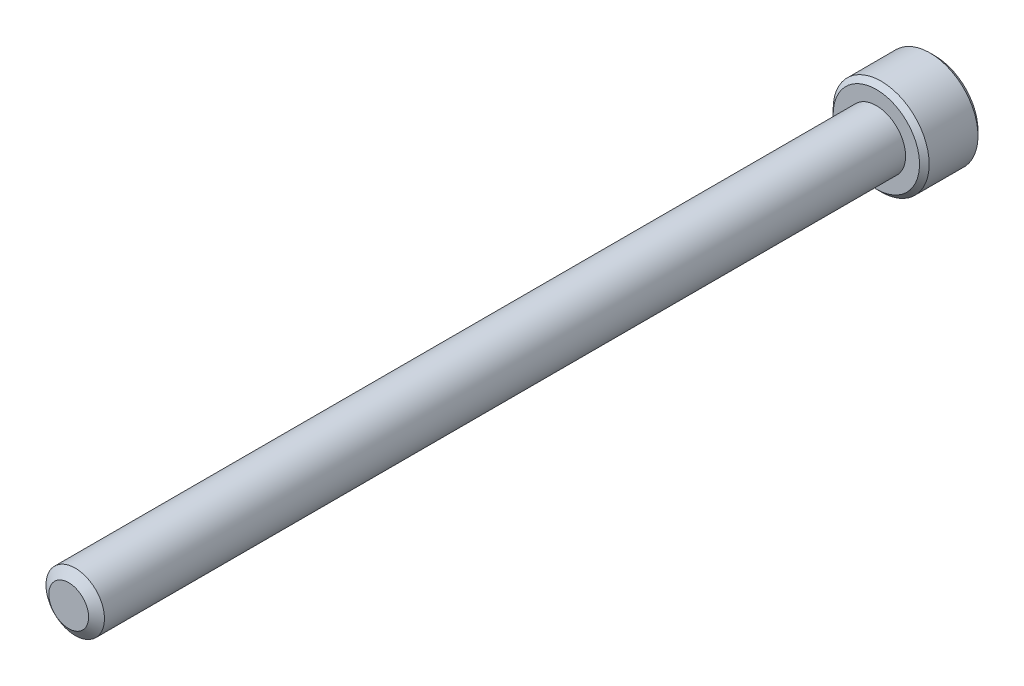
ISO-10303-21;
HEADER;
FILE_DESCRIPTION(('STEP AP214'),'2;1');
FILE_NAME('part.step','',(''),(''),'','','');
FILE_SCHEMA(('AUTOMOTIVE_DESIGN { 1 0 10303 214 1 1 1 1 }'));
ENDSEC;
DATA;
#1=APPLICATION_CONTEXT('core data for automotive mechanical design processes');
#2=APPLICATION_PROTOCOL_DEFINITION('international standard','automotive_design',2000,#1);
#3=PRODUCT_CONTEXT('',#1,'mechanical');
#4=PRODUCT('Part','Part','',(#3));
#5=PRODUCT_RELATED_PRODUCT_CATEGORY('part','',(#4));
#6=PRODUCT_DEFINITION_FORMATION('','',#4);
#7=PRODUCT_DEFINITION_CONTEXT('part definition',#1,'design');
#8=PRODUCT_DEFINITION('design','',#6,#7);
#9=PRODUCT_DEFINITION_SHAPE('','',#8);
#10=(LENGTH_UNIT() NAMED_UNIT(*) SI_UNIT(.MILLI.,.METRE.));
#11=(NAMED_UNIT(*) PLANE_ANGLE_UNIT() SI_UNIT($,.RADIAN.));
#12=(NAMED_UNIT(*) SI_UNIT($,.STERADIAN.) SOLID_ANGLE_UNIT());
#13=UNCERTAINTY_MEASURE_WITH_UNIT(LENGTH_MEASURE(1.E-05),#10,'distance_accuracy_value','');
#14=(GEOMETRIC_REPRESENTATION_CONTEXT(3) GLOBAL_UNCERTAINTY_ASSIGNED_CONTEXT((#13)) GLOBAL_UNIT_ASSIGNED_CONTEXT((#10,
#11,#12)) REPRESENTATION_CONTEXT('',''));
#15=CARTESIAN_POINT('',(0.,0.,0.));
#16=DIRECTION('',(0.,0.,1.));
#17=DIRECTION('',(1.,0.,0.));
#18=AXIS2_PLACEMENT_3D('',#15,#16,#17);
#19=CARTESIAN_POINT('',(0.,0.,-4.826));
#20=DIRECTION('',(0.,0.,1.));
#21=DIRECTION('',(1.,0.,0.));
#22=AXIS2_PLACEMENT_3D('',#19,#20,#21);
#23=PLANE('',#22);
#24=CARTESIAN_POINT('',(0.,0.,-4.826));
#25=DIRECTION('',(0.,0.,1.));
#26=DIRECTION('',(1.,0.,0.));
#27=AXIS2_PLACEMENT_3D('',#24,#25,#26);
#28=CIRCLE('',#27,3.56616000000001);
#29=CARTESIAN_POINT('',(3.56616000000001,0.,-4.826));
#30=VERTEX_POINT('',#29);
#31=EDGE_CURVE('E11',#30,#30,#28,.F.);
#32=ORIENTED_EDGE('',*,*,#31,.T.);
#33=EDGE_LOOP('',(#32));
#34=FACE_BOUND('',#33,.T.);
#35=CARTESIAN_POINT('',(0.,0.,-4.826));
#36=DIRECTION('',(0.,0.,-1.));
#37=DIRECTION('',(-1.,0.,0.));
#38=AXIS2_PLACEMENT_3D('',#35,#36,#37);
#39=CIRCLE('',#38,2.29135888084633);
#40=CARTESIAN_POINT('',(1.984375,1.14567944042316,-4.826));
#41=VERTEX_POINT('',#40);
#42=CARTESIAN_POINT('',(1.984375,-1.14567944042317,-4.826));
#43=VERTEX_POINT('',#42);
#44=EDGE_CURVE('E57',#41,#43,#39,.T.);
#45=ORIENTED_EDGE('',*,*,#44,.F.);
#46=CARTESIAN_POINT('',(0.,2.29135888084633,-4.826));
#47=VERTEX_POINT('',#46);
#48=EDGE_CURVE('E133',#47,#41,#39,.T.);
#49=ORIENTED_EDGE('',*,*,#48,.F.);
#50=CARTESIAN_POINT('',(-1.984375,1.14567944042317,-4.826));
#51=VERTEX_POINT('',#50);
#52=EDGE_CURVE('E130',#51,#47,#39,.T.);
#53=ORIENTED_EDGE('',*,*,#52,.F.);
#54=CARTESIAN_POINT('',(-1.984375,-1.14567944042317,-4.826));
#55=VERTEX_POINT('',#54);
#56=EDGE_CURVE('E97',#55,#51,#39,.T.);
#57=ORIENTED_EDGE('',*,*,#56,.F.);
#58=CARTESIAN_POINT('',(0.,-2.29135888084633,-4.826));
#59=VERTEX_POINT('',#58);
#60=EDGE_CURVE('E89',#59,#55,#39,.T.);
#61=ORIENTED_EDGE('',*,*,#60,.F.);
#62=EDGE_CURVE('E50',#43,#59,#39,.T.);
#63=ORIENTED_EDGE('',*,*,#62,.F.);
#64=EDGE_LOOP('',(#45,#49,#53,#57,#61,#63));
#65=FACE_BOUND('',#64,.T.);
#66=ADVANCED_FACE('F36',(#34,#65),#23,.F.);
#67=CARTESIAN_POINT('',(0.,0.,66.675));
#68=DIRECTION('',(0.,0.,-1.));
#69=DIRECTION('',(-1.,0.,0.));
#70=AXIS2_PLACEMENT_3D('',#67,#68,#69);
#71=CYLINDRICAL_SURFACE('',#70,2.413);
#72=CARTESIAN_POINT('',(0.,0.,66.1361512711798));
#73=DIRECTION('',(0.,0.,-1.));
#74=DIRECTION('',(-1.,0.,0.));
#75=AXIS2_PLACEMENT_3D('',#72,#73,#74);
#76=CIRCLE('',#75,2.413);
#77=CARTESIAN_POINT('',(-2.413,0.,66.1361512711798));
#78=VERTEX_POINT('',#77);
#79=EDGE_CURVE('E165',#78,#78,#76,.T.);
#80=ORIENTED_EDGE('',*,*,#79,.T.);
#81=EDGE_LOOP('',(#80));
#82=FACE_BOUND('',#81,.T.);
#83=CARTESIAN_POINT('',(0.,0.,0.));
#84=DIRECTION('',(0.,0.,1.));
#85=DIRECTION('',(1.,0.,0.));
#86=AXIS2_PLACEMENT_3D('',#83,#84,#85);
#87=CIRCLE('',#86,2.413);
#88=CARTESIAN_POINT('',(2.413,0.,0.));
#89=VERTEX_POINT('',#88);
#90=EDGE_CURVE('E164',#89,#89,#87,.T.);
#91=ORIENTED_EDGE('',*,*,#90,.T.);
#92=EDGE_LOOP('',(#91));
#93=FACE_BOUND('',#92,.T.);
#94=ADVANCED_FACE('F231',(#82,#93),#71,.T.);
#95=CARTESIAN_POINT('',(0.,0.,66.675));
#96=DIRECTION('',(0.,0.,-1.));
#97=DIRECTION('',(-1.,0.,0.));
#98=AXIS2_PLACEMENT_3D('',#95,#96,#97);
#99=CONICAL_SURFACE('',#98,1.643444262,0.95993108859688);
#100=ORIENTED_EDGE('',*,*,#79,.F.);
#101=EDGE_LOOP('',(#100));
#102=FACE_BOUND('',#101,.T.);
#103=CARTESIAN_POINT('',(0.,0.,66.675));
#104=DIRECTION('',(0.,0.,-1.));
#105=DIRECTION('',(-1.,0.,0.));
#106=AXIS2_PLACEMENT_3D('',#103,#104,#105);
#107=CIRCLE('',#106,1.643444262);
#108=CARTESIAN_POINT('',(-1.643444262,0.,66.675));
#109=VERTEX_POINT('',#108);
#110=EDGE_CURVE('E109',#109,#109,#107,.T.);
#111=ORIENTED_EDGE('',*,*,#110,.T.);
#112=EDGE_LOOP('',(#111));
#113=FACE_BOUND('',#112,.T.);
#114=ADVANCED_FACE('F241',(#102,#113),#99,.T.);
#115=CARTESIAN_POINT('',(0.,0.,66.675));
#116=DIRECTION('',(0.,0.,1.));
#117=DIRECTION('',(1.,0.,0.));
#118=AXIS2_PLACEMENT_3D('',#115,#116,#117);
#119=PLANE('',#118);
#120=ORIENTED_EDGE('',*,*,#110,.F.);
#121=EDGE_LOOP('',(#120));
#122=FACE_BOUND('',#121,.T.);
#123=ADVANCED_FACE('F239',(#122),#119,.T.);
#124=CARTESIAN_POINT('',(0.,0.,-4.826));
#125=DIRECTION('',(0.,0.,1.));
#126=DIRECTION('',(1.,0.,0.));
#127=AXIS2_PLACEMENT_3D('',#124,#125,#126);
#128=CYLINDRICAL_SURFACE('',#127,3.9624);
#129=CARTESIAN_POINT('',(0.,0.,-0.396240000000008));
#130=DIRECTION('',(0.,0.,1.));
#131=DIRECTION('',(1.,0.,0.));
#132=AXIS2_PLACEMENT_3D('',#129,#130,#131);
#133=CIRCLE('',#132,3.9624);
#134=CARTESIAN_POINT('',(-3.9624,0.,-0.396240000000008));
#135=VERTEX_POINT('',#134);
#136=EDGE_CURVE('E44',#135,#135,#133,.F.);
#137=ORIENTED_EDGE('',*,*,#136,.T.);
#138=EDGE_LOOP('',(#137));
#139=FACE_BOUND('',#138,.T.);
#140=CARTESIAN_POINT('',(0.,0.,-4.42976000000001));
#141=DIRECTION('',(0.,0.,1.));
#142=DIRECTION('',(1.,0.,0.));
#143=AXIS2_PLACEMENT_3D('',#140,#141,#142);
#144=CIRCLE('',#143,3.9624);
#145=CARTESIAN_POINT('',(3.9624,0.,-4.42976000000001));
#146=VERTEX_POINT('',#145);
#147=EDGE_CURVE('E261',#146,#146,#144,.T.);
#148=ORIENTED_EDGE('',*,*,#147,.T.);
#149=EDGE_LOOP('',(#148));
#150=FACE_BOUND('',#149,.T.);
#151=ADVANCED_FACE('F235',(#139,#150),#128,.T.);
#152=CARTESIAN_POINT('',(0.,0.,0.));
#153=DIRECTION('',(0.,0.,1.));
#154=DIRECTION('',(1.,0.,0.));
#155=AXIS2_PLACEMENT_3D('',#152,#153,#154);
#156=PLANE('',#155);
#157=CARTESIAN_POINT('',(0.,0.,0.));
#158=DIRECTION('',(0.,0.,1.));
#159=DIRECTION('',(1.,0.,0.));
#160=AXIS2_PLACEMENT_3D('',#157,#158,#159);
#161=CIRCLE('',#160,3.56616);
#162=CARTESIAN_POINT('',(-3.56616,0.,0.));
#163=VERTEX_POINT('',#162);
#164=EDGE_CURVE('E108',#163,#163,#161,.T.);
#165=ORIENTED_EDGE('',*,*,#164,.T.);
#166=EDGE_LOOP('',(#165));
#167=FACE_BOUND('',#166,.T.);
#168=ORIENTED_EDGE('',*,*,#90,.F.);
#169=EDGE_LOOP('',(#168));
#170=FACE_BOUND('',#169,.T.);
#171=ADVANCED_FACE('F185',(#167,#170),#156,.T.);
#172=CARTESIAN_POINT('',(0.,0.,-4.826));
#173=DIRECTION('',(0.,0.,-1.));
#174=DIRECTION('',(-1.,0.,0.));
#175=AXIS2_PLACEMENT_3D('',#172,#173,#174);
#176=CONICAL_SURFACE('',#175,2.29135888084633,0.78539816339745);
#177=CARTESIAN_POINT('',(-1.984375,4.38635024598007,-7.34897519782274));
#178=CARTESIAN_POINT('',(-1.984375,4.25778236916222,-7.23187255043514));
#179=CARTESIAN_POINT('',(-1.984375,4.12880938963501,-7.1152075711675));
#180=CARTESIAN_POINT('',(-1.984375,3.8697150482739,-6.88309307113962));
#181=CARTESIAN_POINT('',(-1.984375,3.73959339744263,-6.76764387326629));
#182=CARTESIAN_POINT('',(-1.984375,3.47693738702936,-6.53749248847528));
#183=CARTESIAN_POINT('',(-1.984375,3.3443922128216,-6.42280261206569));
#184=CARTESIAN_POINT('',(-1.984375,3.07740414215957,-6.19568123842686));
#185=CARTESIAN_POINT('',(-1.984375,2.94296150861167,-6.08324943345639));
#186=CARTESIAN_POINT('',(-1.984375,2.69093433000247,-5.87745000368473));
#187=CARTESIAN_POINT('',(-1.984375,2.57369587574335,-5.78365991859573));
#188=CARTESIAN_POINT('',(-1.984375,2.33669402095219,-5.59933006518558));
#189=CARTESIAN_POINT('',(-1.984375,2.21693090511933,-5.5087899334554));
#190=CARTESIAN_POINT('',(-1.984375,1.97414978626332,-5.33250529335592));
#191=CARTESIAN_POINT('',(-1.984375,1.8511363783479,-5.24675449786087));
#192=CARTESIAN_POINT('',(-1.984375,1.60051911268812,-5.08227129509849));
#193=CARTESIAN_POINT('',(-1.984375,1.47291846186661,-5.00353411359307));
#194=CARTESIAN_POINT('',(-1.984375,1.2789090002779,-4.89486132815752));
#195=CARTESIAN_POINT('',(-1.984375,1.21488472401634,-4.86070149112759));
#196=CARTESIAN_POINT('',(-1.984375,1.08519642932975,-4.79566586392286));
#197=CARTESIAN_POINT('',(-1.984375,1.01953210237452,-4.76479069750205));
#198=CARTESIAN_POINT('',(-1.984375,0.81999148678731,-4.67842375900681));
#199=CARTESIAN_POINT('',(-1.984375,0.683245753728957,-4.62900101211804));
#200=CARTESIAN_POINT('',(-1.984375,0.48625684861587,-4.5769842359019));
#201=CARTESIAN_POINT('',(-1.984375,0.428714400653208,-4.56399752017917));
#202=CARTESIAN_POINT('',(-1.984375,0.312779003368322,-4.5427082809321));
#203=CARTESIAN_POINT('',(-1.984375,0.254386491647091,-4.53440342902996));
#204=CARTESIAN_POINT('',(-1.984375,0.137202439336304,-4.52290067704976));
#205=CARTESIAN_POINT('',(-1.984375,0.0784118196893296,-4.51969349911655));
#206=CARTESIAN_POINT('',(-1.984375,-0.0392233767990006,-4.51853221278239));
#207=CARTESIAN_POINT('',(-1.984375,-0.0980679542441397,-4.52057816389864));
#208=CARTESIAN_POINT('',(-1.984375,-0.21520013647359,-4.52979857799852));
#209=CARTESIAN_POINT('',(-1.984375,-0.273488761914176,-4.53696028481731));
#210=CARTESIAN_POINT('',(-1.984375,-0.389286265316371,-4.55603259141478));
#211=CARTESIAN_POINT('',(-1.984375,-0.446794960098088,-4.567944287499));
#212=CARTESIAN_POINT('',(-1.984375,-0.56091102362673,-4.59602327187489));
#213=CARTESIAN_POINT('',(-1.984375,-0.61751563591901,-4.61220162881068));
#214=CARTESIAN_POINT('',(-1.984375,-0.729535693290378,-4.64820502249007));
#215=CARTESIAN_POINT('',(-1.984375,-0.784951198991555,-4.66802987283546));
#216=CARTESIAN_POINT('',(-1.984375,-0.914325334864688,-4.7184487048077));
#217=CARTESIAN_POINT('',(-1.984375,-0.987772757857292,-4.7503494712672));
#218=CARTESIAN_POINT('',(-1.984375,-1.13259042621503,-4.81859015311983));
#219=CARTESIAN_POINT('',(-1.984375,-1.20395954857947,-4.85493241529602));
#220=CARTESIAN_POINT('',(-1.984375,-1.34496189830389,-4.93112595582489));
#221=CARTESIAN_POINT('',(-1.984375,-1.41459154292871,-4.97098381524999));
#222=CARTESIAN_POINT('',(-1.984375,-1.55223895461487,-5.05340283838906));
#223=CARTESIAN_POINT('',(-1.984375,-1.62025639194186,-5.09596454866417));
#224=CARTESIAN_POINT('',(-1.984375,-1.823662914216,-5.22772004019455));
#225=CARTESIAN_POINT('',(-1.984375,-1.95694317622707,-5.32016210087376));
#226=CARTESIAN_POINT('',(-1.984375,-2.21933064334271,-5.51039077948145));
#227=CARTESIAN_POINT('',(-1.984375,-2.34844239081737,-5.60817124432184));
#228=CARTESIAN_POINT('',(-1.984375,-2.64424712607428,-5.83898376478607));
#229=CARTESIAN_POINT('',(-1.984375,-2.80988215135694,-5.97336658258107));
#230=CARTESIAN_POINT('',(-1.984375,-3.13786393939787,-6.24620657210738));
#231=CARTESIAN_POINT('',(-1.984375,-3.30020907072943,-6.38466568561171));
#232=CARTESIAN_POINT('',(-1.984375,-3.61743160532523,-6.65987341299285));
#233=CARTESIAN_POINT('',(-1.984375,-3.77238267778691,-6.79653731694909));
#234=CARTESIAN_POINT('',(-1.984375,-4.00353093931969,-7.00284090592041));
#235=CARTESIAN_POINT('',(-1.984375,-4.08033809401079,-7.0718000308107));
#236=CARTESIAN_POINT('',(-1.984375,-4.23359721811938,-7.21010924523581));
#237=CARTESIAN_POINT('',(-1.984375,-4.31004919377067,-7.27945932786121));
#238=CARTESIAN_POINT('',(-1.984375,-4.38635024598007,-7.34897519782274));
#239=B_SPLINE_CURVE_WITH_KNOTS('',3,(#177,#178,#179,#180,#181,#182,#183,#184,#185,#186,#187,
#188,#189,#190,#191,#192,#193,#194,#195,#196,#197,#198,#199,#200,#201,#202,#203,#204,#205,#206,
#207,#208,#209,#210,#211,#212,#213,#214,#215,#216,#217,#218,#219,#220,#221,#222,#223,#224,#225,
#226,#227,#228,#229,#230,#231,#232,#233,#234,#235,#236,#237,#238),.UNSPECIFIED.,.F.,.F.,(4,2,2,
2,2,2,2,2,2,2,2,2,2,2,2,2,2,2,2,2,2,2,2,2,2,2,2,2,2,2,4),(0.,0.521719337468404,1.04357390539815,
1.56938723748946,2.09512841606326,2.54550444646996,2.99582995804647,3.44554970250013,
3.89496094065995,4.11257110412757,4.33022251794828,4.76440966817832,4.94122399976167,
5.11795032054924,5.29435462654118,5.47076093117717,5.64672889434269,5.82273749473955,
5.99920726953631,6.17566802621274,6.41569497411234,6.655849299482,6.89646313424995,
7.1371257628443,7.62347501633089,8.10927507181707,8.74903978219147,9.38911434398421,
10.0089169746635,10.3185808917335,10.6282393531493),.UNSPECIFIED.);
#240=EDGE_CURVE('E102',#51,#55,#239,.T.);
#241=ORIENTED_EDGE('',*,*,#240,.T.);
#242=ORIENTED_EDGE('',*,*,#56,.T.);
#243=EDGE_LOOP('',(#241,#242));
#244=FACE_BOUND('',#243,.T.);
#245=ADVANCED_FACE('F103',(#244),#176,.F.);
#246=CARTESIAN_POINT('',(0.000199999999999783,2.29147435090017,-4.82611547878184));
#247=CARTESIAN_POINT('',(-0.0680159951668025,2.25208982772758,-4.78676285226391));
#248=CARTESIAN_POINT('',(-0.137372685106966,2.21204672412052,-4.74972131044618));
#249=CARTESIAN_POINT('',(-0.278798800452188,2.13039431835551,-4.68189885842332));
#250=CARTESIAN_POINT('',(-0.350881678736783,2.08877724917394,-4.65115568909175));
#251=CARTESIAN_POINT('',(-0.496233397266004,2.00485839535392,-4.59849188881121));
#252=CARTESIAN_POINT('',(-0.569465212486939,1.96257798712287,-4.57643887587996));
#253=CARTESIAN_POINT('',(-0.717541182594706,1.87708628592063,-4.54246149294388));
#254=CARTESIAN_POINT('',(-0.792380812753425,1.83387760530244,-4.53051175609173));
#255=CARTESIAN_POINT('',(-0.921360414543816,1.75941119748879,-4.5197300990819));
#256=CARTESIAN_POINT('',(-0.975333715772442,1.72824969749539,-4.51813389905907));
#257=CARTESIAN_POINT('',(-1.0831921185198,1.66597761963484,-4.52082183886529));
#258=CARTESIAN_POINT('',(-1.13707718248552,1.63486706344893,-4.52510804034046));
#259=CARTESIAN_POINT('',(-1.2443385382486,1.57293969082547,-4.53931687301352));
#260=CARTESIAN_POINT('',(-1.29771419276014,1.54212324232506,-4.54924581045227));
#261=CARTESIAN_POINT('',(-1.4035425174089,1.48102323060122,-4.57419508427454));
#262=CARTESIAN_POINT('',(-1.4559952579711,1.45073962671789,-4.58921503038949));
#263=CARTESIAN_POINT('',(-1.59035733896365,1.37316564308797,-4.63380785163567));
#264=CARTESIAN_POINT('',(-1.67143335715833,1.32635638215845,-4.66674299593833));
#265=CARTESIAN_POINT('',(-1.79064830672984,1.25752759893191,-4.7223424412022));
#266=CARTESIAN_POINT('',(-1.829934924386,1.23484545965257,-4.74187759205186));
#267=CARTESIAN_POINT('',(-1.90778036186805,1.18990137536713,-4.7827287381194));
#268=CARTESIAN_POINT('',(-1.9463396111017,1.16763918244233,-4.80404363956835));
#269=CARTESIAN_POINT('',(-1.984575,1.14556397036933,-4.82611547878184));
#270=B_SPLINE_CURVE_WITH_KNOTS('',3,(#246,#247,#248,#249,#250,#251,#252,#253,#254,#255,#256,
#257,#258,#259,#260,#261,#262,#263,#264,#265,#266,#267,#268,#269),.UNSPECIFIED.,.F.,.F.,(4,2,2,
2,2,2,2,2,2,2,2,4),(0.,0.264339630306626,0.530219665093694,0.79187641637146,1.05287424418109,
1.239639843932,1.42647091743852,1.61351120244035,1.8005371524754,2.09764209964316,
2.24579179873714,2.39385111134157),.UNSPECIFIED.);
#271=EDGE_CURVE('E132',#47,#51,#270,.T.);
#272=ORIENTED_EDGE('',*,*,#271,.T.);
#273=ORIENTED_EDGE('',*,*,#52,.T.);
#274=EDGE_LOOP('',(#272,#273));
#275=FACE_BOUND('',#274,.T.);
#276=ADVANCED_FACE('F184',(#275),#176,.F.);
#277=CARTESIAN_POINT('',(1.984575,1.14556397036933,-4.82611547878184));
#278=CARTESIAN_POINT('',(1.9163590048332,1.18494849354192,-4.78676285226391));
#279=CARTESIAN_POINT('',(1.84700231489303,1.22499159714897,-4.74972131044618));
#280=CARTESIAN_POINT('',(1.70557619954781,1.30664400291398,-4.68189885842332));
#281=CARTESIAN_POINT('',(1.63349332126322,1.34826107209555,-4.65115568909175));
#282=CARTESIAN_POINT('',(1.488141602734,1.43217992591557,-4.59849188881121));
#283=CARTESIAN_POINT('',(1.41490978751306,1.47446033414663,-4.57643887587996));
#284=CARTESIAN_POINT('',(1.26683381740529,1.55995203534886,-4.54246149294388));
#285=CARTESIAN_POINT('',(1.19199418724658,1.60316071596705,-4.53051175609173));
#286=CARTESIAN_POINT('',(1.06301458545619,1.6776271237807,-4.5197300990819));
#287=CARTESIAN_POINT('',(1.00904128422756,1.7087886237741,-4.51813389905907));
#288=CARTESIAN_POINT('',(0.901182881480201,1.77106070163465,-4.52082183886529));
#289=CARTESIAN_POINT('',(0.847297817514478,1.80217125782056,-4.52510804034046));
#290=CARTESIAN_POINT('',(0.740036461751397,1.86409863044402,-4.53931687301352));
#291=CARTESIAN_POINT('',(0.686660807239861,1.89491507894443,-4.54924581045227));
#292=CARTESIAN_POINT('',(0.580832482591104,1.95601509066828,-4.57419508427454));
#293=CARTESIAN_POINT('',(0.528379742028899,1.9862986945516,-4.58921503038949));
#294=CARTESIAN_POINT('',(0.394017661036352,2.06387267818152,-4.63380785163567));
#295=CARTESIAN_POINT('',(0.312941642841677,2.11068193911104,-4.66674299593833));
#296=CARTESIAN_POINT('',(0.193726693270161,2.17951072233758,-4.7223424412022));
#297=CARTESIAN_POINT('',(0.154440075614,2.20219286161692,-4.74187759205186));
#298=CARTESIAN_POINT('',(0.0765946381319476,2.24713694590237,-4.7827287381194));
#299=CARTESIAN_POINT('',(0.0380353888983018,2.26939913882716,-4.80404363956835));
#300=CARTESIAN_POINT('',(-0.000199999999999806,2.29147435090017,-4.82611547878184));
#301=B_SPLINE_CURVE_WITH_KNOTS('',3,(#277,#278,#279,#280,#281,#282,#283,#284,#285,#286,#287,
#288,#289,#290,#291,#292,#293,#294,#295,#296,#297,#298,#299,#300),.UNSPECIFIED.,.F.,.F.,(4,2,2,
2,2,2,2,2,2,2,2,4),(0.,0.264339630306626,0.530219665093694,0.791876416371459,1.05287424418109,
1.239639843932,1.42647091743852,1.61351120244035,1.8005371524754,2.09764209964316,
2.24579179873714,2.39385111134157),.UNSPECIFIED.);
#302=EDGE_CURVE('E136',#41,#47,#301,.T.);
#303=ORIENTED_EDGE('',*,*,#302,.T.);
#304=ORIENTED_EDGE('',*,*,#48,.T.);
#305=EDGE_LOOP('',(#303,#304));
#306=FACE_BOUND('',#305,.T.);
#307=ADVANCED_FACE('F139',(#306),#176,.F.);
#308=CARTESIAN_POINT('',(1.984375,-4.38635024598007,-7.34897519782274));
#309=CARTESIAN_POINT('',(1.984375,-4.25778236916222,-7.23187255043513));
#310=CARTESIAN_POINT('',(1.984375,-4.12880938963501,-7.1152075711675));
#311=CARTESIAN_POINT('',(1.984375,-3.86971504827389,-6.88309307113962));
#312=CARTESIAN_POINT('',(1.984375,-3.73959339744262,-6.76764387326629));
#313=CARTESIAN_POINT('',(1.984375,-3.47693738702935,-6.53749248847528));
#314=CARTESIAN_POINT('',(1.984375,-3.3443922128216,-6.42280261206568));
#315=CARTESIAN_POINT('',(1.984375,-3.07740414215957,-6.19568123842686));
#316=CARTESIAN_POINT('',(1.984375,-2.94296150861167,-6.08324943345639));
#317=CARTESIAN_POINT('',(1.984375,-2.69093433000247,-5.87745000368473));
#318=CARTESIAN_POINT('',(1.984375,-2.57369587574335,-5.78365991859572));
#319=CARTESIAN_POINT('',(1.984375,-2.33669402095219,-5.59933006518558));
#320=CARTESIAN_POINT('',(1.984375,-2.21693090511933,-5.5087899334554));
#321=CARTESIAN_POINT('',(1.984375,-1.97414978626332,-5.33250529335592));
#322=CARTESIAN_POINT('',(1.984375,-1.85113637834789,-5.24675449786087));
#323=CARTESIAN_POINT('',(1.984375,-1.60051911268812,-5.08227129509849));
#324=CARTESIAN_POINT('',(1.984375,-1.47291846186661,-5.00353411359307));
#325=CARTESIAN_POINT('',(1.984375,-1.2789090002779,-4.89486132815752));
#326=CARTESIAN_POINT('',(1.984375,-1.21488472401634,-4.86070149112759));
#327=CARTESIAN_POINT('',(1.984375,-1.08519642932975,-4.79566586392286));
#328=CARTESIAN_POINT('',(1.984375,-1.01953210237452,-4.76479069750204));
#329=CARTESIAN_POINT('',(1.984375,-0.819991486787309,-4.67842375900681));
#330=CARTESIAN_POINT('',(1.984375,-0.683245753728956,-4.62900101211804));
#331=CARTESIAN_POINT('',(1.984375,-0.486256848615869,-4.5769842359019));
#332=CARTESIAN_POINT('',(1.984375,-0.428714400653207,-4.56399752017917));
#333=CARTESIAN_POINT('',(1.984375,-0.312779003368321,-4.54270828093209));
#334=CARTESIAN_POINT('',(1.984375,-0.25438649164709,-4.53440342902996));
#335=CARTESIAN_POINT('',(1.984375,-0.137202439336303,-4.52290067704976));
#336=CARTESIAN_POINT('',(1.984375,-0.0784118196893286,-4.51969349911655));
#337=CARTESIAN_POINT('',(1.984375,0.0392233767990016,-4.51853221278239));
#338=CARTESIAN_POINT('',(1.984375,0.0980679542441407,-4.52057816389864));
#339=CARTESIAN_POINT('',(1.984375,0.215200136473591,-4.52979857799852));
#340=CARTESIAN_POINT('',(1.984375,0.273488761914177,-4.53696028481731));
#341=CARTESIAN_POINT('',(1.984375,0.389286265316373,-4.55603259141478));
#342=CARTESIAN_POINT('',(1.984375,0.446794960098089,-4.567944287499));
#343=CARTESIAN_POINT('',(1.984375,0.560911023626731,-4.59602327187489));
#344=CARTESIAN_POINT('',(1.984375,0.617515635919012,-4.61220162881068));
#345=CARTESIAN_POINT('',(1.984375,0.729535693290379,-4.64820502249007));
#346=CARTESIAN_POINT('',(1.984375,0.784951198991556,-4.66802987283546));
#347=CARTESIAN_POINT('',(1.984375,0.914325334864689,-4.7184487048077));
#348=CARTESIAN_POINT('',(1.984375,0.987772757857293,-4.7503494712672));
#349=CARTESIAN_POINT('',(1.984375,1.13259042621504,-4.81859015311983));
#350=CARTESIAN_POINT('',(1.984375,1.20395954857947,-4.85493241529602));
#351=CARTESIAN_POINT('',(1.984375,1.34496189830389,-4.93112595582489));
#352=CARTESIAN_POINT('',(1.984375,1.41459154292871,-4.97098381524999));
#353=CARTESIAN_POINT('',(1.984375,1.55223895461488,-5.05340283838906));
#354=CARTESIAN_POINT('',(1.984375,1.62025639194186,-5.09596454866417));
#355=CARTESIAN_POINT('',(1.984375,1.823662914216,-5.22772004019455));
#356=CARTESIAN_POINT('',(1.984375,1.95694317622707,-5.32016210087376));
#357=CARTESIAN_POINT('',(1.984375,2.21933064334271,-5.51039077948145));
#358=CARTESIAN_POINT('',(1.984375,2.34844239081737,-5.60817124432184));
#359=CARTESIAN_POINT('',(1.984375,2.64424712607429,-5.83898376478608));
#360=CARTESIAN_POINT('',(1.984375,2.80988215135694,-5.97336658258107));
#361=CARTESIAN_POINT('',(1.984375,3.13786393939788,-6.24620657210738));
#362=CARTESIAN_POINT('',(1.984375,3.30020907072944,-6.38466568561171));
#363=CARTESIAN_POINT('',(1.984375,3.61743160532523,-6.65987341299285));
#364=CARTESIAN_POINT('',(1.984375,3.77238267778691,-6.79653731694909));
#365=CARTESIAN_POINT('',(1.984375,4.00353093931969,-7.00284090592041));
#366=CARTESIAN_POINT('',(1.984375,4.08033809401079,-7.0718000308107));
#367=CARTESIAN_POINT('',(1.984375,4.23359721811938,-7.21010924523581));
#368=CARTESIAN_POINT('',(1.984375,4.31004919377067,-7.27945932786121));
#369=CARTESIAN_POINT('',(1.984375,4.38635024598007,-7.34897519782274));
#370=B_SPLINE_CURVE_WITH_KNOTS('',3,(#308,#309,#310,#311,#312,#313,#314,#315,#316,#317,#318,
#319,#320,#321,#322,#323,#324,#325,#326,#327,#328,#329,#330,#331,#332,#333,#334,#335,#336,#337,
#338,#339,#340,#341,#342,#343,#344,#345,#346,#347,#348,#349,#350,#351,#352,#353,#354,#355,#356,
#357,#358,#359,#360,#361,#362,#363,#364,#365,#366,#367,#368,#369),.UNSPECIFIED.,.F.,.F.,(4,2,2,
2,2,2,2,2,2,2,2,2,2,2,2,2,2,2,2,2,2,2,2,2,2,2,2,2,2,2,4),(0.,0.521719337468404,1.04357390539815,
1.56938723748946,2.09512841606326,2.54550444646996,2.99582995804647,3.44554970250013,
3.89496094065995,4.11257110412757,4.33022251794828,4.76440966817832,4.94122399976167,
5.11795032054924,5.29435462654118,5.47076093117717,5.64672889434269,5.82273749473954,
5.99920726953631,6.17566802621274,6.41569497411234,6.655849299482,6.89646313424995,
7.13712576284429,7.62347501633089,8.10927507181707,8.74903978219147,9.38911434398421,
10.0089169746635,10.3185808917335,10.6282393531493),.UNSPECIFIED.);
#371=EDGE_CURVE('E145',#43,#41,#370,.T.);
#372=ORIENTED_EDGE('',*,*,#371,.T.);
#373=ORIENTED_EDGE('',*,*,#44,.T.);
#374=EDGE_LOOP('',(#372,#373));
#375=FACE_BOUND('',#374,.T.);
#376=ADVANCED_FACE('F355',(#375),#176,.F.);
#377=CARTESIAN_POINT('',(-0.000200000000000217,-2.29147435090017,-4.82611547878184));
#378=CARTESIAN_POINT('',(0.0680159951668023,-2.25208982772757,-4.78676285226391));
#379=CARTESIAN_POINT('',(0.137372685106966,-2.21204672412052,-4.74972131044618));
#380=CARTESIAN_POINT('',(0.278798800452187,-2.13039431835551,-4.68189885842332));
#381=CARTESIAN_POINT('',(0.350881678736782,-2.08877724917394,-4.65115568909175));
#382=CARTESIAN_POINT('',(0.496233397266004,-2.00485839535392,-4.59849188881121));
#383=CARTESIAN_POINT('',(0.569465212486938,-1.96257798712287,-4.57643887587996));
#384=CARTESIAN_POINT('',(0.717541182594706,-1.87708628592063,-4.54246149294387));
#385=CARTESIAN_POINT('',(0.792380812753424,-1.83387760530244,-4.53051175609173));
#386=CARTESIAN_POINT('',(0.921360414543815,-1.75941119748879,-4.5197300990819));
#387=CARTESIAN_POINT('',(0.975333715772442,-1.72824969749539,-4.51813389905907));
#388=CARTESIAN_POINT('',(1.0831921185198,-1.66597761963484,-4.52082183886529));
#389=CARTESIAN_POINT('',(1.13707718248552,-1.63486706344893,-4.52510804034046));
#390=CARTESIAN_POINT('',(1.2443385382486,-1.57293969082547,-4.53931687301352));
#391=CARTESIAN_POINT('',(1.29771419276014,-1.54212324232506,-4.54924581045227));
#392=CARTESIAN_POINT('',(1.4035425174089,-1.48102323060122,-4.57419508427454));
#393=CARTESIAN_POINT('',(1.4559952579711,-1.45073962671789,-4.58921503038949));
#394=CARTESIAN_POINT('',(1.59035733896365,-1.37316564308797,-4.63380785163567));
#395=CARTESIAN_POINT('',(1.67143335715832,-1.32635638215845,-4.66674299593833));
#396=CARTESIAN_POINT('',(1.79064830672984,-1.25752759893191,-4.7223424412022));
#397=CARTESIAN_POINT('',(1.829934924386,-1.23484545965257,-4.74187759205186));
#398=CARTESIAN_POINT('',(1.90778036186805,-1.18990137536712,-4.7827287381194));
#399=CARTESIAN_POINT('',(1.9463396111017,-1.16763918244233,-4.80404363956835));
#400=CARTESIAN_POINT('',(1.984575,-1.14556397036933,-4.82611547878184));
#401=B_SPLINE_CURVE_WITH_KNOTS('',3,(#377,#378,#379,#380,#381,#382,#383,#384,#385,#386,#387,
#388,#389,#390,#391,#392,#393,#394,#395,#396,#397,#398,#399,#400),.UNSPECIFIED.,.F.,.F.,(4,2,2,
2,2,2,2,2,2,2,2,4),(0.,0.264339630306626,0.530219665093694,0.79187641637146,1.05287424418109,
1.239639843932,1.42647091743852,1.61351120244035,1.8005371524754,2.09764209964316,
2.24579179873714,2.39385111134157),.UNSPECIFIED.);
#402=EDGE_CURVE('E121',#59,#43,#401,.T.);
#403=ORIENTED_EDGE('',*,*,#402,.T.);
#404=ORIENTED_EDGE('',*,*,#62,.T.);
#405=EDGE_LOOP('',(#403,#404));
#406=FACE_BOUND('',#405,.T.);
#407=ADVANCED_FACE('F347',(#406),#176,.F.);
#408=CARTESIAN_POINT('',(-1.984575,-1.14556397036933,-4.82611547878184));
#409=CARTESIAN_POINT('',(-1.9163590048332,-1.18494849354192,-4.78676285226391));
#410=CARTESIAN_POINT('',(-1.84700231489303,-1.22499159714897,-4.74972131044618));
#411=CARTESIAN_POINT('',(-1.70557619954781,-1.30664400291398,-4.68189885842332));
#412=CARTESIAN_POINT('',(-1.63349332126322,-1.34826107209555,-4.65115568909175));
#413=CARTESIAN_POINT('',(-1.488141602734,-1.43217992591557,-4.59849188881121));
#414=CARTESIAN_POINT('',(-1.41490978751306,-1.47446033414662,-4.57643887587996));
#415=CARTESIAN_POINT('',(-1.2668338174053,-1.55995203534886,-4.54246149294387));
#416=CARTESIAN_POINT('',(-1.19199418724658,-1.60316071596705,-4.53051175609173));
#417=CARTESIAN_POINT('',(-1.06301458545619,-1.6776271237807,-4.5197300990819));
#418=CARTESIAN_POINT('',(-1.00904128422756,-1.7087886237741,-4.51813389905907));
#419=CARTESIAN_POINT('',(-0.901182881480201,-1.77106070163465,-4.52082183886529));
#420=CARTESIAN_POINT('',(-0.847297817514478,-1.80217125782056,-4.52510804034046));
#421=CARTESIAN_POINT('',(-0.740036461751398,-1.86409863044402,-4.53931687301352));
#422=CARTESIAN_POINT('',(-0.686660807239861,-1.89491507894443,-4.54924581045227));
#423=CARTESIAN_POINT('',(-0.580832482591105,-1.95601509066827,-4.57419508427454));
#424=CARTESIAN_POINT('',(-0.5283797420289,-1.9862986945516,-4.58921503038949));
#425=CARTESIAN_POINT('',(-0.394017661036353,-2.06387267818152,-4.63380785163567));
#426=CARTESIAN_POINT('',(-0.312941642841677,-2.11068193911104,-4.66674299593833));
#427=CARTESIAN_POINT('',(-0.193726693270162,-2.17951072233758,-4.7223424412022));
#428=CARTESIAN_POINT('',(-0.154440075614,-2.20219286161692,-4.74187759205186));
#429=CARTESIAN_POINT('',(-0.0765946381319478,-2.24713694590237,-4.7827287381194));
#430=CARTESIAN_POINT('',(-0.0380353888983019,-2.26939913882716,-4.80404363956835));
#431=CARTESIAN_POINT('',(0.000199999999999776,-2.29147435090017,-4.82611547878184));
#432=B_SPLINE_CURVE_WITH_KNOTS('',3,(#408,#409,#410,#411,#412,#413,#414,#415,#416,#417,#418,
#419,#420,#421,#422,#423,#424,#425,#426,#427,#428,#429,#430,#431),.UNSPECIFIED.,.F.,.F.,(4,2,2,
2,2,2,2,2,2,2,2,4),(0.,0.264339630306626,0.530219665093693,0.791876416371459,1.05287424418109,
1.239639843932,1.42647091743852,1.61351120244034,1.8005371524754,2.09764209964316,
2.24579179873714,2.39385111134157),.UNSPECIFIED.);
#433=EDGE_CURVE('E93',#55,#59,#432,.T.);
#434=ORIENTED_EDGE('',*,*,#433,.T.);
#435=ORIENTED_EDGE('',*,*,#60,.T.);
#436=EDGE_LOOP('',(#434,#435));
#437=FACE_BOUND('',#436,.T.);
#438=ADVANCED_FACE('F91',(#437),#176,.F.);
#439=CARTESIAN_POINT('',(0.,0.,-1.8494375));
#440=DIRECTION('',(0.,0.,1.));
#441=DIRECTION('',(1.,0.,0.));
#442=AXIS2_PLACEMENT_3D('',#439,#440,#441);
#443=PLANE('',#442);
#444=DIRECTION('',(0.866025403784439,-0.5,0.));
#445=VECTOR('',#444,1.);
#446=CARTESIAN_POINT('',(-0.9921875,-1.71851916063475,-1.8494375));
#447=LINE('',#446,#445);
#448=CARTESIAN_POINT('',(-1.984375,-1.14567944042316,-1.8494375));
#449=VERTEX_POINT('',#448);
#450=CARTESIAN_POINT('',(0.,-2.29135888084633,-1.8494375));
#451=VERTEX_POINT('',#450);
#452=EDGE_CURVE('E120',#449,#451,#447,.T.);
#453=ORIENTED_EDGE('',*,*,#452,.F.);
#454=DIRECTION('',(0.,-1.,0.));
#455=VECTOR('',#454,1.);
#456=CARTESIAN_POINT('',(-1.984375,0.,-1.8494375));
#457=LINE('',#456,#455);
#458=CARTESIAN_POINT('',(-1.984375,1.14567944042316,-1.8494375));
#459=VERTEX_POINT('',#458);
#460=EDGE_CURVE('E125',#459,#449,#457,.T.);
#461=ORIENTED_EDGE('',*,*,#460,.F.);
#462=DIRECTION('',(-0.866025403784439,-0.5,0.));
#463=VECTOR('',#462,1.);
#464=CARTESIAN_POINT('',(-0.992187500000001,1.71851916063475,-1.8494375));
#465=LINE('',#464,#463);
#466=CARTESIAN_POINT('',(0.,2.29135888084633,-1.8494375));
#467=VERTEX_POINT('',#466);
#468=EDGE_CURVE('E415',#467,#459,#465,.T.);
#469=ORIENTED_EDGE('',*,*,#468,.F.);
#470=DIRECTION('',(-0.866025403784439,0.5,0.));
#471=VECTOR('',#470,1.);
#472=CARTESIAN_POINT('',(0.9921875,1.71851916063475,-1.8494375));
#473=LINE('',#472,#471);
#474=CARTESIAN_POINT('',(1.984375,1.14567944042316,-1.8494375));
#475=VERTEX_POINT('',#474);
#476=EDGE_CURVE('E154',#475,#467,#473,.T.);
#477=ORIENTED_EDGE('',*,*,#476,.F.);
#478=DIRECTION('',(0.,1.,0.));
#479=VECTOR('',#478,1.);
#480=CARTESIAN_POINT('',(1.984375,0.,-1.8494375));
#481=LINE('',#480,#479);
#482=CARTESIAN_POINT('',(1.984375,-1.14567944042316,-1.8494375));
#483=VERTEX_POINT('',#482);
#484=EDGE_CURVE('E410',#483,#475,#481,.T.);
#485=ORIENTED_EDGE('',*,*,#484,.F.);
#486=DIRECTION('',(0.866025403784439,0.5,0.));
#487=VECTOR('',#486,1.);
#488=CARTESIAN_POINT('',(0.9921875,-1.71851916063475,-1.8494375));
#489=LINE('',#488,#487);
#490=EDGE_CURVE('E409',#451,#483,#489,.T.);
#491=ORIENTED_EDGE('',*,*,#490,.F.);
#492=EDGE_LOOP('',(#453,#461,#469,#477,#485,#491));
#493=FACE_BOUND('',#492,.T.);
#494=ADVANCED_FACE('F186',(#493),#443,.F.);
#495=CARTESIAN_POINT('',(-1.984375,0.,-1.8494375));
#496=DIRECTION('',(1.,0.,0.));
#497=DIRECTION('',(0.,0.,-1.));
#498=AXIS2_PLACEMENT_3D('',#495,#496,#497);
#499=PLANE('',#498);
#500=ORIENTED_EDGE('',*,*,#240,.F.);
#501=DIRECTION('',(0.,0.,-1.));
#502=VECTOR('',#501,1.);
#503=CARTESIAN_POINT('',(-1.984375,1.14567944042316,-1.8494375));
#504=LINE('',#503,#502);
#505=EDGE_CURVE('E126',#459,#51,#504,.T.);
#506=ORIENTED_EDGE('',*,*,#505,.F.);
#507=ORIENTED_EDGE('',*,*,#460,.T.);
#508=DIRECTION('',(0.,0.,-1.));
#509=VECTOR('',#508,1.);
#510=CARTESIAN_POINT('',(-1.984375,-1.14567944042316,-1.8494375));
#511=LINE('',#510,#509);
#512=EDGE_CURVE('E116',#449,#55,#511,.T.);
#513=ORIENTED_EDGE('',*,*,#512,.T.);
#514=EDGE_LOOP('',(#500,#506,#507,#513));
#515=FACE_BOUND('',#514,.T.);
#516=ADVANCED_FACE('F123',(#515),#499,.T.);
#517=CARTESIAN_POINT('',(-0.992187500000001,1.71851916063475,-1.8494375));
#518=DIRECTION('',(0.5,-0.866025403784439,0.));
#519=DIRECTION('',(0.866025403784439,0.5,0.));
#520=AXIS2_PLACEMENT_3D('',#517,#518,#519);
#521=PLANE('',#520);
#522=ORIENTED_EDGE('',*,*,#271,.F.);
#523=DIRECTION('',(0.,0.,-1.));
#524=VECTOR('',#523,1.);
#525=CARTESIAN_POINT('',(0.,2.29135888084633,-1.8494375));
#526=LINE('',#525,#524);
#527=EDGE_CURVE('E150',#467,#47,#526,.T.);
#528=ORIENTED_EDGE('',*,*,#527,.F.);
#529=ORIENTED_EDGE('',*,*,#468,.T.);
#530=ORIENTED_EDGE('',*,*,#505,.T.);
#531=EDGE_LOOP('',(#522,#528,#529,#530));
#532=FACE_BOUND('',#531,.T.);
#533=ADVANCED_FACE('F149',(#532),#521,.T.);
#534=CARTESIAN_POINT('',(0.9921875,1.71851916063475,-1.8494375));
#535=DIRECTION('',(-0.5,-0.866025403784439,0.));
#536=DIRECTION('',(0.866025403784439,-0.5,0.));
#537=AXIS2_PLACEMENT_3D('',#534,#535,#536);
#538=PLANE('',#537);
#539=ORIENTED_EDGE('',*,*,#302,.F.);
#540=DIRECTION('',(0.,0.,-1.));
#541=VECTOR('',#540,1.);
#542=CARTESIAN_POINT('',(1.984375,1.14567944042316,-1.8494375));
#543=LINE('',#542,#541);
#544=EDGE_CURVE('E155',#475,#41,#543,.T.);
#545=ORIENTED_EDGE('',*,*,#544,.F.);
#546=ORIENTED_EDGE('',*,*,#476,.T.);
#547=ORIENTED_EDGE('',*,*,#527,.T.);
#548=EDGE_LOOP('',(#539,#545,#546,#547));
#549=FACE_BOUND('',#548,.T.);
#550=ADVANCED_FACE('F152',(#549),#538,.T.);
#551=CARTESIAN_POINT('',(1.984375,0.,-1.8494375));
#552=DIRECTION('',(-1.,0.,0.));
#553=DIRECTION('',(0.,0.,1.));
#554=AXIS2_PLACEMENT_3D('',#551,#552,#553);
#555=PLANE('',#554);
#556=ORIENTED_EDGE('',*,*,#371,.F.);
#557=DIRECTION('',(0.,0.,-1.));
#558=VECTOR('',#557,1.);
#559=CARTESIAN_POINT('',(1.984375,-1.14567944042316,-1.8494375));
#560=LINE('',#559,#558);
#561=EDGE_CURVE('E157',#483,#43,#560,.T.);
#562=ORIENTED_EDGE('',*,*,#561,.F.);
#563=ORIENTED_EDGE('',*,*,#484,.T.);
#564=ORIENTED_EDGE('',*,*,#544,.T.);
#565=EDGE_LOOP('',(#556,#562,#563,#564));
#566=FACE_BOUND('',#565,.T.);
#567=ADVANCED_FACE('F222',(#566),#555,.T.);
#568=CARTESIAN_POINT('',(0.9921875,-1.71851916063475,-1.8494375));
#569=DIRECTION('',(-0.5,0.866025403784438,0.));
#570=DIRECTION('',(-0.866025403784439,-0.5,0.));
#571=AXIS2_PLACEMENT_3D('',#568,#569,#570);
#572=PLANE('',#571);
#573=ORIENTED_EDGE('',*,*,#402,.F.);
#574=DIRECTION('',(0.,0.,-1.));
#575=VECTOR('',#574,1.);
#576=CARTESIAN_POINT('',(0.,-2.29135888084633,-1.8494375));
#577=LINE('',#576,#575);
#578=EDGE_CURVE('E119',#451,#59,#577,.T.);
#579=ORIENTED_EDGE('',*,*,#578,.F.);
#580=ORIENTED_EDGE('',*,*,#490,.T.);
#581=ORIENTED_EDGE('',*,*,#561,.T.);
#582=EDGE_LOOP('',(#573,#579,#580,#581));
#583=FACE_BOUND('',#582,.T.);
#584=ADVANCED_FACE('F219',(#583),#572,.T.);
#585=CARTESIAN_POINT('',(-0.9921875,-1.71851916063475,-1.8494375));
#586=DIRECTION('',(0.5,0.866025403784439,0.));
#587=DIRECTION('',(-0.866025403784439,0.5,0.));
#588=AXIS2_PLACEMENT_3D('',#585,#586,#587);
#589=PLANE('',#588);
#590=ORIENTED_EDGE('',*,*,#433,.F.);
#591=ORIENTED_EDGE('',*,*,#512,.F.);
#592=ORIENTED_EDGE('',*,*,#452,.T.);
#593=ORIENTED_EDGE('',*,*,#578,.T.);
#594=EDGE_LOOP('',(#590,#591,#592,#593));
#595=FACE_BOUND('',#594,.T.);
#596=ADVANCED_FACE('F114',(#595),#589,.T.);
#597=CARTESIAN_POINT('',(0.,0.,0.));
#598=DIRECTION('',(0.,0.,-1.));
#599=DIRECTION('',(-1.,0.,0.));
#600=AXIS2_PLACEMENT_3D('',#597,#598,#599);
#601=CONICAL_SURFACE('',#600,3.56616,0.78539816339744);
#602=CARTESIAN_POINT('',(-3.9624,0.,-0.396240000000008));
#603=CARTESIAN_POINT('',(-3.9582725,0.,-0.392112500000008));
#604=CARTESIAN_POINT('',(-3.954145,0.,-0.387985000000008));
#605=CARTESIAN_POINT('',(-3.94589,0.,-0.379730000000007));
#606=CARTESIAN_POINT('',(-3.9417625,0.,-0.375602500000007));
#607=CARTESIAN_POINT('',(-3.9335075,0.,-0.367347500000007));
#608=CARTESIAN_POINT('',(-3.92938,0.,-0.363220000000007));
#609=CARTESIAN_POINT('',(-3.921125,0.,-0.354965000000007));
#610=CARTESIAN_POINT('',(-3.9169975,0.,-0.350837500000007));
#611=CARTESIAN_POINT('',(-3.9087425,0.,-0.342582500000007));
#612=CARTESIAN_POINT('',(-3.904615,0.,-0.338455000000007));
#613=CARTESIAN_POINT('',(-3.89636,0.,-0.330200000000007));
#614=CARTESIAN_POINT('',(-3.8922325,0.,-0.326072500000007));
#615=CARTESIAN_POINT('',(-3.8839775,0.,-0.317817500000006));
#616=CARTESIAN_POINT('',(-3.87985,0.,-0.313690000000006));
#617=CARTESIAN_POINT('',(-3.871595,0.,-0.305435000000006));
#618=CARTESIAN_POINT('',(-3.8674675,0.,-0.301307500000006));
#619=CARTESIAN_POINT('',(-3.8592125,0.,-0.293052500000006));
#620=CARTESIAN_POINT('',(-3.855085,0.,-0.288925000000006));
#621=CARTESIAN_POINT('',(-3.84683,0.,-0.280670000000006));
#622=CARTESIAN_POINT('',(-3.8427025,0.,-0.276542500000005));
#623=CARTESIAN_POINT('',(-3.8344475,0.,-0.268287500000005));
#624=CARTESIAN_POINT('',(-3.83032,0.,-0.264160000000005));
#625=CARTESIAN_POINT('',(-3.822065,0.,-0.255905000000005));
#626=CARTESIAN_POINT('',(-3.8179375,0.,-0.251777500000005));
#627=CARTESIAN_POINT('',(-3.8096825,0.,-0.243522500000005));
#628=CARTESIAN_POINT('',(-3.805555,0.,-0.239395000000005));
#629=CARTESIAN_POINT('',(-3.7973,0.,-0.231140000000005));
#630=CARTESIAN_POINT('',(-3.7931725,0.,-0.227012500000005));
#631=CARTESIAN_POINT('',(-3.7849175,0.,-0.218757500000004));
#632=CARTESIAN_POINT('',(-3.78079,0.,-0.214630000000004));
#633=CARTESIAN_POINT('',(-3.772535,0.,-0.206375000000004));
#634=CARTESIAN_POINT('',(-3.7684075,0.,-0.202247500000004));
#635=CARTESIAN_POINT('',(-3.7601525,0.,-0.193992500000004));
#636=CARTESIAN_POINT('',(-3.756025,0.,-0.189865000000004));
#637=CARTESIAN_POINT('',(-3.74777,0.,-0.181610000000004));
#638=CARTESIAN_POINT('',(-3.7436425,0.,-0.177482500000003));
#639=CARTESIAN_POINT('',(-3.7353875,0.,-0.169227500000003));
#640=CARTESIAN_POINT('',(-3.73126,0.,-0.165100000000003));
#641=CARTESIAN_POINT('',(-3.723005,0.,-0.156845000000003));
#642=CARTESIAN_POINT('',(-3.7188775,0.,-0.152717500000003));
#643=CARTESIAN_POINT('',(-3.7106225,0.,-0.144462500000003));
#644=CARTESIAN_POINT('',(-3.706495,0.,-0.140335000000003));
#645=CARTESIAN_POINT('',(-3.69824,0.,-0.132080000000003));
#646=CARTESIAN_POINT('',(-3.6941125,0.,-0.127952500000003));
#647=CARTESIAN_POINT('',(-3.6858575,0.,-0.119697500000002));
#648=CARTESIAN_POINT('',(-3.68173,0.,-0.115570000000002));
#649=CARTESIAN_POINT('',(-3.673475,0.,-0.107315000000002));
#650=CARTESIAN_POINT('',(-3.6693475,0.,-0.103187500000002));
#651=CARTESIAN_POINT('',(-3.6610925,0.,-0.0949325000000019));
#652=CARTESIAN_POINT('',(-3.656965,0.,-0.0908050000000018));
#653=CARTESIAN_POINT('',(-3.64871,0.,-0.0825500000000016));
#654=CARTESIAN_POINT('',(-3.6445825,0.,-0.0784225000000015));
#655=CARTESIAN_POINT('',(-3.6363275,0.,-0.0701675000000013));
#656=CARTESIAN_POINT('',(-3.6322,0.,-0.0660400000000013));
#657=CARTESIAN_POINT('',(-3.623945,0.,-0.0577850000000011));
#658=CARTESIAN_POINT('',(-3.6198175,0.,-0.0536575000000011));
#659=CARTESIAN_POINT('',(-3.6115625,0.,-0.0454025000000009));
#660=CARTESIAN_POINT('',(-3.607435,0.,-0.0412750000000008));
#661=CARTESIAN_POINT('',(-3.59918,0.,-0.0330200000000006));
#662=CARTESIAN_POINT('',(-3.5950525,0.,-0.0288925000000006));
#663=CARTESIAN_POINT('',(-3.5867975,0.,-0.0206375000000004));
#664=CARTESIAN_POINT('',(-3.58267,0.,-0.0165100000000003));
#665=CARTESIAN_POINT('',(-3.574415,0.,-0.00825500000000009));
#666=CARTESIAN_POINT('',(-3.5702875,0.,-0.00412749999999997));
#667=CARTESIAN_POINT('',(-3.56616,0.,0.));
#668=B_SPLINE_CURVE_WITH_KNOTS('',3,(#602,#603,#604,#605,#606,#607,#608,#609,#610,#611,#612,
#613,#614,#615,#616,#617,#618,#619,#620,#621,#622,#623,#624,#625,#626,#627,#628,#629,#630,#631,
#632,#633,#634,#635,#636,#637,#638,#639,#640,#641,#642,#643,#644,#645,#646,#647,#648,#649,#650,
#651,#652,#653,#654,#655,#656,#657,#658,#659,#660,#661,#662,#663,#664,#665,#666,#667),
.UNSPECIFIED.,.F.,.F.,(4,2,2,2,2,2,2,2,2,2,2,2,2,2,2,2,2,2,2,2,2,2,2,2,2,2,2,2,2,2,2,2,4),(0.,
0.0175114994360848,0.0350229988721697,0.0525344983082552,0.07004599774434,0.0875574971804252,
0.10506899661651,0.122580496052595,0.14009199548868,0.157603494924765,0.17511499436085,
0.192626493796935,0.21013799323302,0.227649492669105,0.245160992105191,0.262672491541275,
0.280183990977361,0.297695490413445,0.315206989849531,0.332718489285616,0.350229988721701,
0.367741488157786,0.385252987593871,0.402764487029956,0.420275986466041,0.437787485902126,
0.455298985338211,0.472810484774296,0.490321984210381,0.507833483646466,0.525344983082551,
0.542856482518636,0.560367981954721),.UNSPECIFIED.);
#669=EDGE_CURVE('BSEAM228',#135,#163,#668,.T.);
#670=ORIENTED_EDGE('',*,*,#136,.F.);
#671=ORIENTED_EDGE('',*,*,#164,.F.);
#672=ORIENTED_EDGE('',*,*,#669,.T.);
#673=ORIENTED_EDGE('',*,*,#669,.F.);
#674=EDGE_LOOP('',(#670,#672,#671,#673));
#675=FACE_BOUND('',#674,.T.);
#676=ADVANCED_FACE('F228',(#675),#601,.T.);
#677=CARTESIAN_POINT('',(0.,0.,-4.42976000000001));
#678=DIRECTION('',(0.,0.,1.));
#679=DIRECTION('',(1.,0.,0.));
#680=AXIS2_PLACEMENT_3D('',#677,#678,#679);
#681=CONICAL_SURFACE('',#680,3.9624,0.785398163397457);
#682=ORIENTED_EDGE('',*,*,#31,.F.);
#683=EDGE_LOOP('',(#682));
#684=FACE_BOUND('',#683,.T.);
#685=ORIENTED_EDGE('',*,*,#147,.F.);
#686=EDGE_LOOP('',(#685));
#687=FACE_BOUND('',#686,.T.);
#688=ADVANCED_FACE('F38',(#684,#687),#681,.T.);
#689=CLOSED_SHELL('',(#66,#94,#114,#123,#151,#171,#245,#276,#307,#376,#407,#438,#494,#516,#533,
#550,#567,#584,#596,#676,#688));
#690=MANIFOLD_SOLID_BREP('B2',#689);
#691=ADVANCED_BREP_SHAPE_REPRESENTATION('',(#18,#690),#14);
#692=SHAPE_DEFINITION_REPRESENTATION(#9,#691);
ENDSEC;
END-ISO-10303-21;
